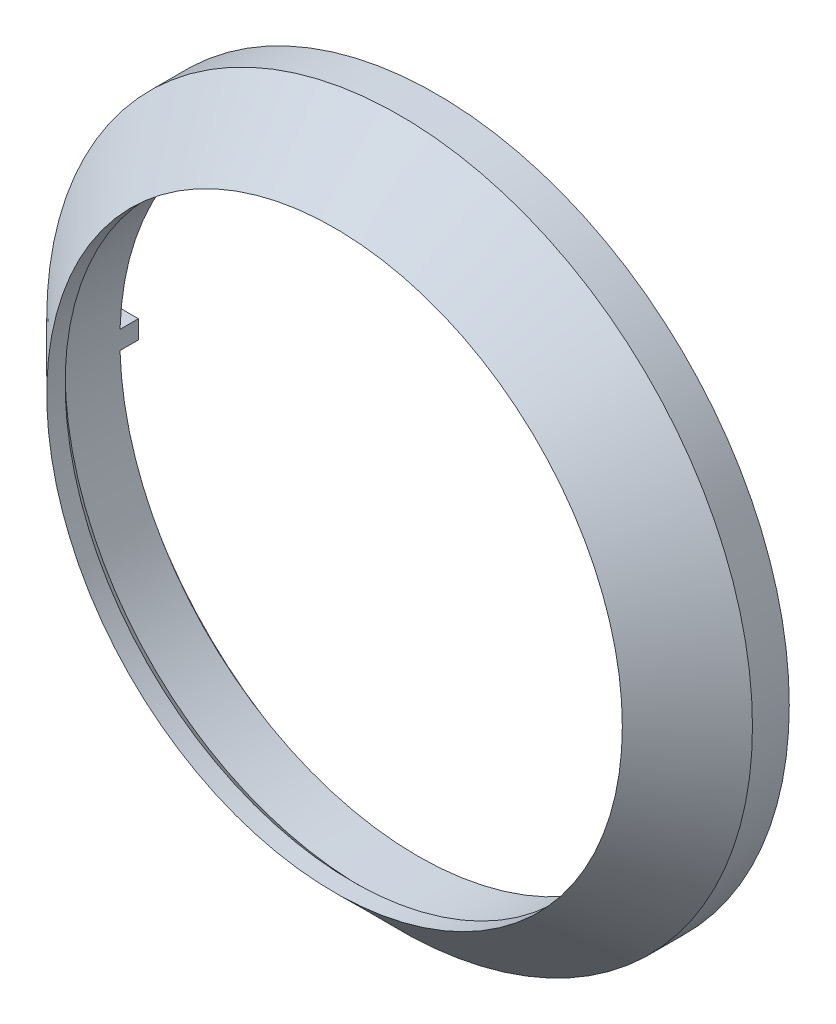
ISO-10303-21;
HEADER;
FILE_DESCRIPTION(('STEP AP214'),'2;1');
FILE_NAME('part.step','',(''),(''),'','','');
FILE_SCHEMA(('AUTOMOTIVE_DESIGN { 1 0 10303 214 1 1 1 1 }'));
ENDSEC;
DATA;
#1=APPLICATION_CONTEXT('core data for automotive mechanical design processes');
#2=APPLICATION_PROTOCOL_DEFINITION('international standard','automotive_design',2000,#1);
#3=PRODUCT_CONTEXT('',#1,'mechanical');
#4=PRODUCT('Part','Part','',(#3));
#5=PRODUCT_RELATED_PRODUCT_CATEGORY('part','',(#4));
#6=PRODUCT_DEFINITION_FORMATION('','',#4);
#7=PRODUCT_DEFINITION_CONTEXT('part definition',#1,'design');
#8=PRODUCT_DEFINITION('design','',#6,#7);
#9=PRODUCT_DEFINITION_SHAPE('','',#8);
#10=(LENGTH_UNIT() NAMED_UNIT(*) SI_UNIT(.MILLI.,.METRE.));
#11=(NAMED_UNIT(*) PLANE_ANGLE_UNIT() SI_UNIT($,.RADIAN.));
#12=(NAMED_UNIT(*) SI_UNIT($,.STERADIAN.) SOLID_ANGLE_UNIT());
#13=UNCERTAINTY_MEASURE_WITH_UNIT(LENGTH_MEASURE(1.E-05),#10,'distance_accuracy_value','');
#14=(GEOMETRIC_REPRESENTATION_CONTEXT(3) GLOBAL_UNCERTAINTY_ASSIGNED_CONTEXT((#13)) GLOBAL_UNIT_ASSIGNED_CONTEXT((#10,
#11,#12)) REPRESENTATION_CONTEXT('',''));
#15=CARTESIAN_POINT('',(0.,0.,0.));
#16=DIRECTION('',(0.,0.,1.));
#17=DIRECTION('',(1.,0.,0.));
#18=AXIS2_PLACEMENT_3D('',#15,#16,#17);
#19=CARTESIAN_POINT('',(-87.8697032435169,0.,0.));
#20=DIRECTION('',(0.,0.,1.));
#21=DIRECTION('',(1.,0.,0.));
#22=AXIS2_PLACEMENT_3D('',#19,#20,#21);
#23=PLANE('',#22);
#24=CARTESIAN_POINT('',(0.,0.,0.));
#25=DIRECTION('',(0.,0.,1.));
#26=DIRECTION('',(1.,0.,0.));
#27=AXIS2_PLACEMENT_3D('',#24,#25,#26);
#28=CIRCLE('',#27,81.);
#29=CARTESIAN_POINT('',(-80.9614105608345,-2.50000000000008,0.));
#30=VERTEX_POINT('',#29);
#31=CARTESIAN_POINT('',(80.9614105608345,-2.50000000000008,0.));
#32=VERTEX_POINT('',#31);
#33=EDGE_CURVE('E156',#30,#32,#28,.T.);
#34=ORIENTED_EDGE('',*,*,#33,.T.);
#35=DIRECTION('',(1.,0.,0.));
#36=VECTOR('',#35,1.);
#37=CARTESIAN_POINT('',(80.9614105608345,-2.50000000000008,0.));
#38=LINE('',#37,#36);
#39=CARTESIAN_POINT('',(87.8341320222596,-2.50000000000008,0.));
#40=VERTEX_POINT('',#39);
#41=EDGE_CURVE('E56',#32,#40,#38,.T.);
#42=ORIENTED_EDGE('',*,*,#41,.T.);
#43=CARTESIAN_POINT('',(0.,0.,0.));
#44=DIRECTION('',(0.,0.,1.));
#45=DIRECTION('',(1.,0.,0.));
#46=AXIS2_PLACEMENT_3D('',#43,#44,#45);
#47=CIRCLE('',#46,87.8697032435169);
#48=CARTESIAN_POINT('',(-87.8341320222596,-2.50000000000008,0.));
#49=VERTEX_POINT('',#48);
#50=EDGE_CURVE('E11',#49,#40,#47,.T.);
#51=ORIENTED_EDGE('',*,*,#50,.F.);
#52=DIRECTION('',(-1.,0.,0.));
#53=VECTOR('',#52,1.);
#54=CARTESIAN_POINT('',(-80.9614105608345,-2.50000000000008,0.));
#55=LINE('',#54,#53);
#56=EDGE_CURVE('E136',#30,#49,#55,.T.);
#57=ORIENTED_EDGE('',*,*,#56,.F.);
#58=EDGE_LOOP('',(#34,#42,#51,#57));
#59=FACE_BOUND('',#58,.T.);
#60=ADVANCED_FACE('F33',(#59),#23,.F.);
#61=CARTESIAN_POINT('',(0.,0.,0.));
#62=DIRECTION('',(0.,0.,1.));
#63=DIRECTION('',(1.,0.,0.));
#64=AXIS2_PLACEMENT_3D('',#61,#62,#63);
#65=CYLINDRICAL_SURFACE('',#64,87.8697032435169);
#66=ORIENTED_EDGE('',*,*,#50,.T.);
#67=DIRECTION('',(0.,0.,1.));
#68=VECTOR('',#67,1.);
#69=CARTESIAN_POINT('',(87.8341320222596,-2.50000000000008,-5.));
#70=LINE('',#69,#68);
#71=CARTESIAN_POINT('',(87.8341320222596,-2.50000000000008,-5.));
#72=VERTEX_POINT('',#71);
#73=EDGE_CURVE('E105',#72,#40,#70,.T.);
#74=ORIENTED_EDGE('',*,*,#73,.F.);
#75=CARTESIAN_POINT('',(0.,0.,-5.));
#76=DIRECTION('',(0.,0.,1.));
#77=DIRECTION('',(1.,0.,0.));
#78=AXIS2_PLACEMENT_3D('',#75,#76,#77);
#79=CIRCLE('',#78,87.8697032435169);
#80=CARTESIAN_POINT('',(-87.8341320222596,-2.50000000000008,-5.));
#81=VERTEX_POINT('',#80);
#82=EDGE_CURVE('E116',#81,#72,#79,.T.);
#83=ORIENTED_EDGE('',*,*,#82,.F.);
#84=DIRECTION('',(0.,0.,1.));
#85=VECTOR('',#84,1.);
#86=CARTESIAN_POINT('',(-87.8341320222596,-2.50000000000008,-5.));
#87=LINE('',#86,#85);
#88=EDGE_CURVE('E140',#81,#49,#87,.T.);
#89=ORIENTED_EDGE('',*,*,#88,.T.);
#90=EDGE_LOOP('',(#66,#74,#83,#89));
#91=FACE_BOUND('',#90,.T.);
#92=ADVANCED_FACE('F188',(#91),#65,.F.);
#93=CARTESIAN_POINT('',(87.8341320222596,2.49999999999992,0.));
#94=VERTEX_POINT('',#93);
#95=CARTESIAN_POINT('',(-87.8341320222596,2.49999999999992,0.));
#96=VERTEX_POINT('',#95);
#97=EDGE_CURVE('E41',#94,#96,#47,.T.);
#98=ORIENTED_EDGE('',*,*,#97,.F.);
#99=DIRECTION('',(-1.,0.,0.));
#100=VECTOR('',#99,1.);
#101=CARTESIAN_POINT('',(80.9614105608345,2.49999999999992,0.));
#102=LINE('',#101,#100);
#103=CARTESIAN_POINT('',(80.9614105608345,2.49999999999994,0.));
#104=VERTEX_POINT('',#103);
#105=EDGE_CURVE('E117',#94,#104,#102,.T.);
#106=ORIENTED_EDGE('',*,*,#105,.T.);
#107=CARTESIAN_POINT('',(-80.9614105608345,2.49999999999994,0.));
#108=VERTEX_POINT('',#107);
#109=EDGE_CURVE('E155',#104,#108,#28,.T.);
#110=ORIENTED_EDGE('',*,*,#109,.T.);
#111=DIRECTION('',(1.,0.,0.));
#112=VECTOR('',#111,1.);
#113=CARTESIAN_POINT('',(-80.9614105608345,2.49999999999992,0.));
#114=LINE('',#113,#112);
#115=EDGE_CURVE('E132',#96,#108,#114,.T.);
#116=ORIENTED_EDGE('',*,*,#115,.F.);
#117=EDGE_LOOP('',(#98,#106,#110,#116));
#118=FACE_BOUND('',#117,.T.);
#119=ADVANCED_FACE('F35',(#118),#23,.F.);
#120=CARTESIAN_POINT('',(87.8341320222596,2.49999999999992,-5.));
#121=VERTEX_POINT('',#120);
#122=CARTESIAN_POINT('',(-87.8341320222596,2.49999999999992,-5.));
#123=VERTEX_POINT('',#122);
#124=EDGE_CURVE('E172',#121,#123,#79,.T.);
#125=ORIENTED_EDGE('',*,*,#124,.F.);
#126=DIRECTION('',(0.,0.,1.));
#127=VECTOR('',#126,1.);
#128=CARTESIAN_POINT('',(87.8341320222596,2.49999999999992,-5.));
#129=LINE('',#128,#127);
#130=EDGE_CURVE('E48',#121,#94,#129,.T.);
#131=ORIENTED_EDGE('',*,*,#130,.T.);
#132=ORIENTED_EDGE('',*,*,#97,.T.);
#133=DIRECTION('',(0.,0.,1.));
#134=VECTOR('',#133,1.);
#135=CARTESIAN_POINT('',(-87.8341320222596,2.49999999999992,-5.));
#136=LINE('',#135,#134);
#137=EDGE_CURVE('E152',#123,#96,#136,.T.);
#138=ORIENTED_EDGE('',*,*,#137,.F.);
#139=EDGE_LOOP('',(#125,#131,#132,#138));
#140=FACE_BOUND('',#139,.T.);
#141=ADVANCED_FACE('F176',(#140),#65,.F.);
#142=CARTESIAN_POINT('',(-95.8697032435169,0.,-5.));
#143=DIRECTION('',(0.,0.,1.));
#144=DIRECTION('',(1.,0.,0.));
#145=AXIS2_PLACEMENT_3D('',#142,#143,#144);
#146=PLANE('',#145);
#147=CARTESIAN_POINT('',(0.,0.,-5.));
#148=DIRECTION('',(0.,0.,1.));
#149=DIRECTION('',(1.,0.,0.));
#150=AXIS2_PLACEMENT_3D('',#147,#148,#149);
#151=CIRCLE('',#150,95.8697032435169);
#152=CARTESIAN_POINT('',(95.8697032435169,0.,-5.));
#153=VERTEX_POINT('',#152);
#154=EDGE_CURVE('E170',#153,#153,#151,.T.);
#155=ORIENTED_EDGE('',*,*,#154,.F.);
#156=EDGE_LOOP('',(#155));
#157=FACE_BOUND('',#156,.T.);
#158=ORIENTED_EDGE('',*,*,#82,.T.);
#159=DIRECTION('',(1.,0.,0.));
#160=VECTOR('',#159,1.);
#161=CARTESIAN_POINT('',(80.9614105608345,-2.50000000000008,-5.));
#162=LINE('',#161,#160);
#163=CARTESIAN_POINT('',(80.9614105608345,-2.50000000000008,-5.));
#164=VERTEX_POINT('',#163);
#165=EDGE_CURVE('E102',#164,#72,#162,.T.);
#166=ORIENTED_EDGE('',*,*,#165,.F.);
#167=CARTESIAN_POINT('',(-5.56124590822549E-10,0.,-5.));
#168=DIRECTION('',(0.,0.,-1.));
#169=DIRECTION('',(1.,0.,0.));
#170=AXIS2_PLACEMENT_3D('',#167,#168,#169);
#171=CIRCLE('',#170,81.0000000005559);
#172=CARTESIAN_POINT('',(80.9614105608345,2.49999999999994,-5.));
#173=VERTEX_POINT('',#172);
#174=EDGE_CURVE('E113',#173,#164,#171,.T.);
#175=ORIENTED_EDGE('',*,*,#174,.F.);
#176=DIRECTION('',(-1.,0.,0.));
#177=VECTOR('',#176,1.);
#178=CARTESIAN_POINT('',(80.9614105608345,2.49999999999992,-5.));
#179=LINE('',#178,#177);
#180=EDGE_CURVE('E122',#121,#173,#179,.T.);
#181=ORIENTED_EDGE('',*,*,#180,.F.);
#182=ORIENTED_EDGE('',*,*,#124,.T.);
#183=DIRECTION('',(1.,0.,0.));
#184=VECTOR('',#183,1.);
#185=CARTESIAN_POINT('',(-80.9614105608345,2.49999999999992,-5.));
#186=LINE('',#185,#184);
#187=CARTESIAN_POINT('',(-80.9614105608345,2.49999999999994,-5.));
#188=VERTEX_POINT('',#187);
#189=EDGE_CURVE('E133',#123,#188,#186,.T.);
#190=ORIENTED_EDGE('',*,*,#189,.T.);
#191=CARTESIAN_POINT('',(5.56124590822549E-10,0.,-5.));
#192=DIRECTION('',(0.,0.,1.));
#193=DIRECTION('',(-1.,0.,0.));
#194=AXIS2_PLACEMENT_3D('',#191,#192,#193);
#195=CIRCLE('',#194,81.0000000005559);
#196=CARTESIAN_POINT('',(-80.9614105608345,-2.50000000000008,-5.));
#197=VERTEX_POINT('',#196);
#198=EDGE_CURVE('E135',#188,#197,#195,.T.);
#199=ORIENTED_EDGE('',*,*,#198,.T.);
#200=DIRECTION('',(-1.,0.,0.));
#201=VECTOR('',#200,1.);
#202=CARTESIAN_POINT('',(-80.9614105608345,-2.50000000000008,-5.));
#203=LINE('',#202,#201);
#204=EDGE_CURVE('E138',#197,#81,#203,.T.);
#205=ORIENTED_EDGE('',*,*,#204,.T.);
#206=EDGE_LOOP('',(#158,#166,#175,#181,#182,#190,#199,#205));
#207=FACE_BOUND('',#206,.T.);
#208=ADVANCED_FACE('F111',(#157,#207),#146,.F.);
#209=CARTESIAN_POINT('',(0.,0.,0.));
#210=DIRECTION('',(0.,0.,1.));
#211=DIRECTION('',(1.,0.,0.));
#212=AXIS2_PLACEMENT_3D('',#209,#210,#211);
#213=CYLINDRICAL_SURFACE('',#212,95.8697032435169);
#214=CARTESIAN_POINT('',(0.,0.,5.));
#215=DIRECTION('',(0.,0.,1.));
#216=DIRECTION('',(1.,0.,0.));
#217=AXIS2_PLACEMENT_3D('',#214,#215,#216);
#218=CIRCLE('',#217,95.8697032435169);
#219=CARTESIAN_POINT('',(95.8697032435169,0.,5.));
#220=VERTEX_POINT('',#219);
#221=EDGE_CURVE('E167',#220,#220,#218,.T.);
#222=ORIENTED_EDGE('',*,*,#221,.F.);
#223=EDGE_LOOP('',(#222));
#224=FACE_BOUND('',#223,.T.);
#225=ORIENTED_EDGE('',*,*,#154,.T.);
#226=EDGE_LOOP('',(#225));
#227=FACE_BOUND('',#226,.T.);
#228=ADVANCED_FACE('F225',(#224,#227),#213,.T.);
#229=CARTESIAN_POINT('',(0.,0.,5.));
#230=DIRECTION('',(0.,0.,-1.));
#231=DIRECTION('',(-1.,0.,0.));
#232=AXIS2_PLACEMENT_3D('',#229,#230,#231);
#233=CONICAL_SURFACE('',#232,95.8697032435169,0.785398163397451);
#234=CARTESIAN_POINT('',(0.,0.,22.6776695296636));
#235=DIRECTION('',(0.,0.,1.));
#236=DIRECTION('',(1.,0.,0.));
#237=AXIS2_PLACEMENT_3D('',#234,#235,#236);
#238=CIRCLE('',#237,78.1920337138532);
#239=CARTESIAN_POINT('',(78.1920337138532,0.,22.6776695296636));
#240=VERTEX_POINT('',#239);
#241=EDGE_CURVE('E164',#240,#240,#238,.T.);
#242=ORIENTED_EDGE('',*,*,#241,.F.);
#243=EDGE_LOOP('',(#242));
#244=FACE_BOUND('',#243,.T.);
#245=ORIENTED_EDGE('',*,*,#221,.T.);
#246=EDGE_LOOP('',(#245));
#247=FACE_BOUND('',#246,.T.);
#248=ADVANCED_FACE('F221',(#244,#247),#233,.T.);
#249=CARTESIAN_POINT('',(0.,0.,0.));
#250=DIRECTION('',(0.,0.,1.));
#251=DIRECTION('',(1.,0.,0.));
#252=AXIS2_PLACEMENT_3D('',#249,#250,#251);
#253=CYLINDRICAL_SURFACE('',#252,78.1920337138532);
#254=CARTESIAN_POINT('',(0.,0.,17.6776695296636));
#255=DIRECTION('',(0.,0.,1.));
#256=DIRECTION('',(1.,0.,0.));
#257=AXIS2_PLACEMENT_3D('',#254,#255,#256);
#258=CIRCLE('',#257,78.1920337138532);
#259=CARTESIAN_POINT('',(78.1920337138532,0.,17.6776695296636));
#260=VERTEX_POINT('',#259);
#261=EDGE_CURVE('E161',#260,#260,#258,.T.);
#262=ORIENTED_EDGE('',*,*,#261,.F.);
#263=EDGE_LOOP('',(#262));
#264=FACE_BOUND('',#263,.T.);
#265=ORIENTED_EDGE('',*,*,#241,.T.);
#266=EDGE_LOOP('',(#265));
#267=FACE_BOUND('',#266,.T.);
#268=ADVANCED_FACE('F217',(#264,#267),#253,.F.);
#269=CARTESIAN_POINT('',(0.,0.,17.6776695296636));
#270=DIRECTION('',(0.,0.,-1.));
#271=DIRECTION('',(-1.,0.,0.));
#272=AXIS2_PLACEMENT_3D('',#269,#270,#271);
#273=CONICAL_SURFACE('',#272,78.1920337138532,0.785398163397453);
#274=CARTESIAN_POINT('',(0.,0.,14.8697032435169));
#275=DIRECTION('',(0.,0.,1.));
#276=DIRECTION('',(1.,0.,0.));
#277=AXIS2_PLACEMENT_3D('',#274,#275,#276);
#278=CIRCLE('',#277,81.);
#279=CARTESIAN_POINT('',(81.,0.,14.8697032435169));
#280=VERTEX_POINT('',#279);
#281=EDGE_CURVE('E158',#280,#280,#278,.T.);
#282=ORIENTED_EDGE('',*,*,#281,.F.);
#283=EDGE_LOOP('',(#282));
#284=FACE_BOUND('',#283,.T.);
#285=ORIENTED_EDGE('',*,*,#261,.T.);
#286=EDGE_LOOP('',(#285));
#287=FACE_BOUND('',#286,.T.);
#288=ADVANCED_FACE('F214',(#284,#287),#273,.F.);
#289=CARTESIAN_POINT('',(0.,0.,0.));
#290=DIRECTION('',(0.,0.,1.));
#291=DIRECTION('',(1.,0.,0.));
#292=AXIS2_PLACEMENT_3D('',#289,#290,#291);
#293=CYLINDRICAL_SURFACE('',#292,81.);
#294=ORIENTED_EDGE('',*,*,#33,.F.);
#295=DIRECTION('',(0.,0.,1.));
#296=VECTOR('',#295,1.);
#297=CARTESIAN_POINT('',(-80.9614105608345,-2.50000000000008,-5.));
#298=LINE('',#297,#296);
#299=EDGE_CURVE('E146',#197,#30,#298,.T.);
#300=ORIENTED_EDGE('',*,*,#299,.F.);
#301=ORIENTED_EDGE('',*,*,#198,.F.);
#302=DIRECTION('',(0.,0.,1.));
#303=VECTOR('',#302,1.);
#304=CARTESIAN_POINT('',(-80.9614105608345,2.49999999999994,-5.));
#305=LINE('',#304,#303);
#306=EDGE_CURVE('E149',#188,#108,#305,.T.);
#307=ORIENTED_EDGE('',*,*,#306,.T.);
#308=ORIENTED_EDGE('',*,*,#109,.F.);
#309=DIRECTION('',(0.,0.,1.));
#310=VECTOR('',#309,1.);
#311=CARTESIAN_POINT('',(80.9614105608345,2.49999999999994,-5.));
#312=LINE('',#311,#310);
#313=EDGE_CURVE('E106',#173,#104,#312,.T.);
#314=ORIENTED_EDGE('',*,*,#313,.F.);
#315=ORIENTED_EDGE('',*,*,#174,.T.);
#316=DIRECTION('',(0.,0.,1.));
#317=VECTOR('',#316,1.);
#318=CARTESIAN_POINT('',(80.9614105608345,-2.50000000000008,-5.));
#319=LINE('',#318,#317);
#320=EDGE_CURVE('E98',#164,#32,#319,.T.);
#321=ORIENTED_EDGE('',*,*,#320,.T.);
#322=EDGE_LOOP('',(#294,#300,#301,#307,#308,#314,#315,#321));
#323=FACE_BOUND('',#322,.T.);
#324=ORIENTED_EDGE('',*,*,#281,.T.);
#325=EDGE_LOOP('',(#324));
#326=FACE_BOUND('',#325,.T.);
#327=ADVANCED_FACE('F119',(#323,#326),#293,.F.);
#328=CARTESIAN_POINT('',(-80.9614105608345,2.49999999999992,-5.));
#329=DIRECTION('',(0.,-1.,0.));
#330=DIRECTION('',(0.,0.,-1.));
#331=AXIS2_PLACEMENT_3D('',#328,#329,#330);
#332=PLANE('',#331);
#333=ORIENTED_EDGE('',*,*,#115,.T.);
#334=ORIENTED_EDGE('',*,*,#306,.F.);
#335=ORIENTED_EDGE('',*,*,#189,.F.);
#336=ORIENTED_EDGE('',*,*,#137,.T.);
#337=EDGE_LOOP('',(#333,#334,#335,#336));
#338=FACE_BOUND('',#337,.T.);
#339=ADVANCED_FACE('F179',(#338),#332,.F.);
#340=CARTESIAN_POINT('',(-80.9614105608345,-2.50000000000008,-5.));
#341=DIRECTION('',(0.,1.,0.));
#342=DIRECTION('',(0.,0.,1.));
#343=AXIS2_PLACEMENT_3D('',#340,#341,#342);
#344=PLANE('',#343);
#345=ORIENTED_EDGE('',*,*,#56,.T.);
#346=ORIENTED_EDGE('',*,*,#88,.F.);
#347=ORIENTED_EDGE('',*,*,#204,.F.);
#348=ORIENTED_EDGE('',*,*,#299,.T.);
#349=EDGE_LOOP('',(#345,#346,#347,#348));
#350=FACE_BOUND('',#349,.T.);
#351=ADVANCED_FACE('F185',(#350),#344,.F.);
#352=CARTESIAN_POINT('',(80.9614105608345,-2.50000000000008,-5.));
#353=DIRECTION('',(0.,-1.,0.));
#354=DIRECTION('',(0.,0.,-1.));
#355=AXIS2_PLACEMENT_3D('',#352,#353,#354);
#356=PLANE('',#355);
#357=ORIENTED_EDGE('',*,*,#41,.F.);
#358=ORIENTED_EDGE('',*,*,#320,.F.);
#359=ORIENTED_EDGE('',*,*,#165,.T.);
#360=ORIENTED_EDGE('',*,*,#73,.T.);
#361=EDGE_LOOP('',(#357,#358,#359,#360));
#362=FACE_BOUND('',#361,.T.);
#363=ADVANCED_FACE('F100',(#362),#356,.T.);
#364=CARTESIAN_POINT('',(80.9614105608345,2.49999999999992,-5.));
#365=DIRECTION('',(0.,1.,0.));
#366=DIRECTION('',(0.,0.,1.));
#367=AXIS2_PLACEMENT_3D('',#364,#365,#366);
#368=PLANE('',#367);
#369=ORIENTED_EDGE('',*,*,#105,.F.);
#370=ORIENTED_EDGE('',*,*,#130,.F.);
#371=ORIENTED_EDGE('',*,*,#180,.T.);
#372=ORIENTED_EDGE('',*,*,#313,.T.);
#373=EDGE_LOOP('',(#369,#370,#371,#372));
#374=FACE_BOUND('',#373,.T.);
#375=ADVANCED_FACE('F200',(#374),#368,.T.);
#376=CLOSED_SHELL('',(#60,#92,#119,#141,#208,#228,#248,#268,#288,#327,#339,#351,#363,#375));
#377=MANIFOLD_SOLID_BREP('B2',#376);
#378=ADVANCED_BREP_SHAPE_REPRESENTATION('',(#18,#377),#14);
#379=SHAPE_DEFINITION_REPRESENTATION(#9,#378);
ENDSEC;
END-ISO-10303-21;
